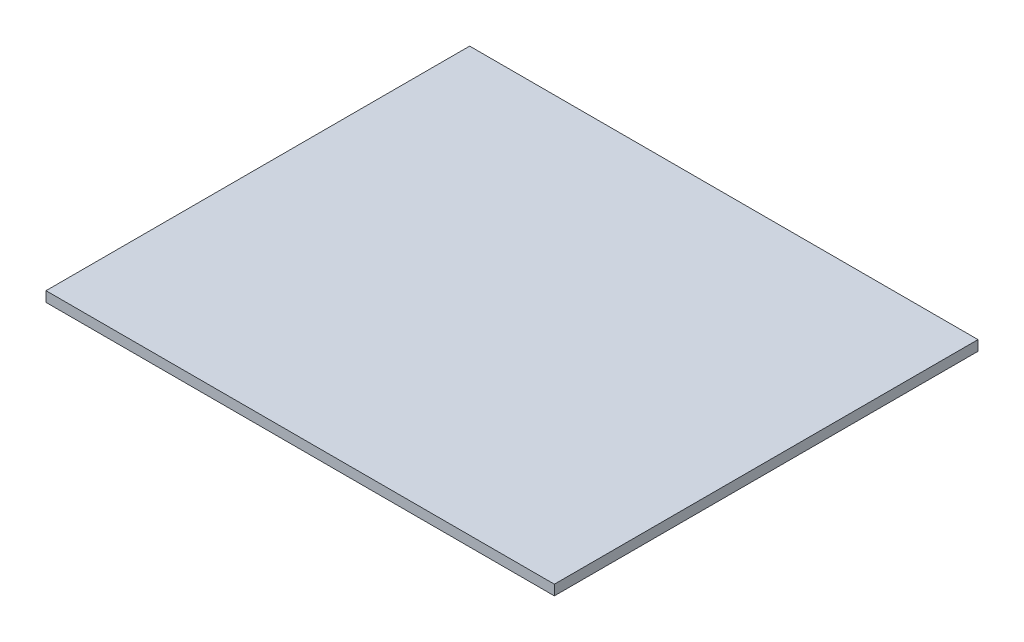
ISO-10303-21;
HEADER;
FILE_DESCRIPTION(('STEP AP214'),'2;1');
FILE_NAME('part.step','',(''),(''),'','','');
FILE_SCHEMA(('AUTOMOTIVE_DESIGN { 1 0 10303 214 1 1 1 1 }'));
ENDSEC;
DATA;
#1=APPLICATION_CONTEXT('core data for automotive mechanical design processes');
#2=APPLICATION_PROTOCOL_DEFINITION('international standard','automotive_design',2000,#1);
#3=PRODUCT_CONTEXT('',#1,'mechanical');
#4=PRODUCT('Part','Part','',(#3));
#5=PRODUCT_RELATED_PRODUCT_CATEGORY('part','',(#4));
#6=PRODUCT_DEFINITION_FORMATION('','',#4);
#7=PRODUCT_DEFINITION_CONTEXT('part definition',#1,'design');
#8=PRODUCT_DEFINITION('design','',#6,#7);
#9=PRODUCT_DEFINITION_SHAPE('','',#8);
#10=(LENGTH_UNIT() NAMED_UNIT(*) SI_UNIT(.MILLI.,.METRE.));
#11=(NAMED_UNIT(*) PLANE_ANGLE_UNIT() SI_UNIT($,.RADIAN.));
#12=(NAMED_UNIT(*) SI_UNIT($,.STERADIAN.) SOLID_ANGLE_UNIT());
#13=UNCERTAINTY_MEASURE_WITH_UNIT(LENGTH_MEASURE(1.E-05),#10,'distance_accuracy_value','');
#14=(GEOMETRIC_REPRESENTATION_CONTEXT(3) GLOBAL_UNCERTAINTY_ASSIGNED_CONTEXT((#13)) GLOBAL_UNIT_ASSIGNED_CONTEXT((#10,
#11,#12)) REPRESENTATION_CONTEXT('',''));
#15=CARTESIAN_POINT('',(0.,0.,0.));
#16=DIRECTION('',(0.,0.,1.));
#17=DIRECTION('',(1.,0.,0.));
#18=AXIS2_PLACEMENT_3D('',#15,#16,#17);
#19=CARTESIAN_POINT('',(30.,1.2,-25.));
#20=DIRECTION('',(-1.,0.,0.));
#21=DIRECTION('',(0.,0.,1.));
#22=AXIS2_PLACEMENT_3D('',#19,#20,#21);
#23=PLANE('',#22);
#24=DIRECTION('',(0.,0.,-1.));
#25=VECTOR('',#24,1.);
#26=CARTESIAN_POINT('',(30.,0.,-25.));
#27=LINE('',#26,#25);
#28=CARTESIAN_POINT('',(30.,0.,25.));
#29=VERTEX_POINT('',#28);
#30=CARTESIAN_POINT('',(30.,0.,-25.));
#31=VERTEX_POINT('',#30);
#32=EDGE_CURVE('E107',#29,#31,#27,.T.);
#33=ORIENTED_EDGE('',*,*,#32,.T.);
#34=DIRECTION('',(0.,-1.,0.));
#35=VECTOR('',#34,1.);
#36=CARTESIAN_POINT('',(30.,1.2,-25.));
#37=LINE('',#36,#35);
#38=CARTESIAN_POINT('',(30.,1.2,-25.));
#39=VERTEX_POINT('',#38);
#40=EDGE_CURVE('E11',#39,#31,#37,.T.);
#41=ORIENTED_EDGE('',*,*,#40,.F.);
#42=DIRECTION('',(0.,0.,-1.));
#43=VECTOR('',#42,1.);
#44=CARTESIAN_POINT('',(30.,1.2,-25.));
#45=LINE('',#44,#43);
#46=CARTESIAN_POINT('',(30.,1.2,25.));
#47=VERTEX_POINT('',#46);
#48=EDGE_CURVE('E91',#47,#39,#45,.T.);
#49=ORIENTED_EDGE('',*,*,#48,.F.);
#50=DIRECTION('',(0.,-1.,0.));
#51=VECTOR('',#50,1.);
#52=CARTESIAN_POINT('',(30.,1.2,25.));
#53=LINE('',#52,#51);
#54=EDGE_CURVE('E103',#47,#29,#53,.T.);
#55=ORIENTED_EDGE('',*,*,#54,.T.);
#56=EDGE_LOOP('',(#33,#41,#49,#55));
#57=FACE_BOUND('',#56,.T.);
#58=ADVANCED_FACE('F39',(#57),#23,.F.);
#59=CARTESIAN_POINT('',(-30.,1.2,-25.));
#60=DIRECTION('',(0.,0.,1.));
#61=DIRECTION('',(1.,0.,0.));
#62=AXIS2_PLACEMENT_3D('',#59,#60,#61);
#63=PLANE('',#62);
#64=DIRECTION('',(-1.,0.,0.));
#65=VECTOR('',#64,1.);
#66=CARTESIAN_POINT('',(-30.,0.,-25.));
#67=LINE('',#66,#65);
#68=CARTESIAN_POINT('',(-30.,0.,-25.));
#69=VERTEX_POINT('',#68);
#70=EDGE_CURVE('E96',#31,#69,#67,.T.);
#71=ORIENTED_EDGE('',*,*,#70,.T.);
#72=DIRECTION('',(0.,-1.,0.));
#73=VECTOR('',#72,1.);
#74=CARTESIAN_POINT('',(-30.,1.2,-25.));
#75=LINE('',#74,#73);
#76=CARTESIAN_POINT('',(-30.,1.2,-25.));
#77=VERTEX_POINT('',#76);
#78=EDGE_CURVE('E48',#77,#69,#75,.T.);
#79=ORIENTED_EDGE('',*,*,#78,.F.);
#80=DIRECTION('',(-1.,0.,0.));
#81=VECTOR('',#80,1.);
#82=CARTESIAN_POINT('',(-30.,1.2,-25.));
#83=LINE('',#82,#81);
#84=EDGE_CURVE('E86',#39,#77,#83,.T.);
#85=ORIENTED_EDGE('',*,*,#84,.F.);
#86=ORIENTED_EDGE('',*,*,#40,.T.);
#87=EDGE_LOOP('',(#71,#79,#85,#86));
#88=FACE_BOUND('',#87,.T.);
#89=ADVANCED_FACE('F95',(#88),#63,.F.);
#90=CARTESIAN_POINT('',(-30.,1.2,-25.));
#91=DIRECTION('',(1.,0.,0.));
#92=DIRECTION('',(0.,0.,-1.));
#93=AXIS2_PLACEMENT_3D('',#90,#91,#92);
#94=PLANE('',#93);
#95=DIRECTION('',(0.,0.,1.));
#96=VECTOR('',#95,1.);
#97=CARTESIAN_POINT('',(-30.,0.,-25.));
#98=LINE('',#97,#96);
#99=CARTESIAN_POINT('',(-30.,0.,25.));
#100=VERTEX_POINT('',#99);
#101=EDGE_CURVE('E73',#69,#100,#98,.T.);
#102=ORIENTED_EDGE('',*,*,#101,.T.);
#103=DIRECTION('',(0.,-1.,0.));
#104=VECTOR('',#103,1.);
#105=CARTESIAN_POINT('',(-30.,1.2,25.));
#106=LINE('',#105,#104);
#107=CARTESIAN_POINT('',(-30.,1.2,25.));
#108=VERTEX_POINT('',#107);
#109=EDGE_CURVE('E98',#108,#100,#106,.T.);
#110=ORIENTED_EDGE('',*,*,#109,.F.);
#111=DIRECTION('',(0.,0.,1.));
#112=VECTOR('',#111,1.);
#113=CARTESIAN_POINT('',(-30.,1.2,-25.));
#114=LINE('',#113,#112);
#115=EDGE_CURVE('E89',#77,#108,#114,.T.);
#116=ORIENTED_EDGE('',*,*,#115,.F.);
#117=ORIENTED_EDGE('',*,*,#78,.T.);
#118=EDGE_LOOP('',(#102,#110,#116,#117));
#119=FACE_BOUND('',#118,.T.);
#120=ADVANCED_FACE('F99',(#119),#94,.F.);
#121=CARTESIAN_POINT('',(-30.,1.2,25.));
#122=DIRECTION('',(0.,0.,-1.));
#123=DIRECTION('',(-1.,0.,0.));
#124=AXIS2_PLACEMENT_3D('',#121,#122,#123);
#125=PLANE('',#124);
#126=DIRECTION('',(1.,0.,0.));
#127=VECTOR('',#126,1.);
#128=CARTESIAN_POINT('',(-30.,0.,25.));
#129=LINE('',#128,#127);
#130=EDGE_CURVE('E79',#100,#29,#129,.T.);
#131=ORIENTED_EDGE('',*,*,#130,.T.);
#132=ORIENTED_EDGE('',*,*,#54,.F.);
#133=DIRECTION('',(1.,0.,0.));
#134=VECTOR('',#133,1.);
#135=CARTESIAN_POINT('',(-30.,1.2,25.));
#136=LINE('',#135,#134);
#137=EDGE_CURVE('E56',#108,#47,#136,.T.);
#138=ORIENTED_EDGE('',*,*,#137,.F.);
#139=ORIENTED_EDGE('',*,*,#109,.T.);
#140=EDGE_LOOP('',(#131,#132,#138,#139));
#141=FACE_BOUND('',#140,.T.);
#142=ADVANCED_FACE('F120',(#141),#125,.F.);
#143=CARTESIAN_POINT('',(0.,1.2,0.));
#144=DIRECTION('',(0.,1.,0.));
#145=DIRECTION('',(0.,0.,1.));
#146=AXIS2_PLACEMENT_3D('',#143,#144,#145);
#147=PLANE('',#146);
#148=ORIENTED_EDGE('',*,*,#48,.T.);
#149=ORIENTED_EDGE('',*,*,#84,.T.);
#150=ORIENTED_EDGE('',*,*,#115,.T.);
#151=ORIENTED_EDGE('',*,*,#137,.T.);
#152=EDGE_LOOP('',(#148,#149,#150,#151));
#153=FACE_BOUND('',#152,.T.);
#154=ADVANCED_FACE('F87',(#153),#147,.T.);
#155=CARTESIAN_POINT('',(0.,0.,0.));
#156=DIRECTION('',(0.,1.,0.));
#157=DIRECTION('',(0.,0.,1.));
#158=AXIS2_PLACEMENT_3D('',#155,#156,#157);
#159=PLANE('',#158);
#160=ORIENTED_EDGE('',*,*,#32,.F.);
#161=ORIENTED_EDGE('',*,*,#130,.F.);
#162=ORIENTED_EDGE('',*,*,#101,.F.);
#163=ORIENTED_EDGE('',*,*,#70,.F.);
#164=EDGE_LOOP('',(#160,#161,#162,#163));
#165=FACE_BOUND('',#164,.T.);
#166=ADVANCED_FACE('F123',(#165),#159,.F.);
#167=CLOSED_SHELL('',(#58,#89,#120,#142,#154,#166));
#168=MANIFOLD_SOLID_BREP('B2',#167);
#169=ADVANCED_BREP_SHAPE_REPRESENTATION('',(#18,#168),#14);
#170=SHAPE_DEFINITION_REPRESENTATION(#9,#169);
ENDSEC;
END-ISO-10303-21;
